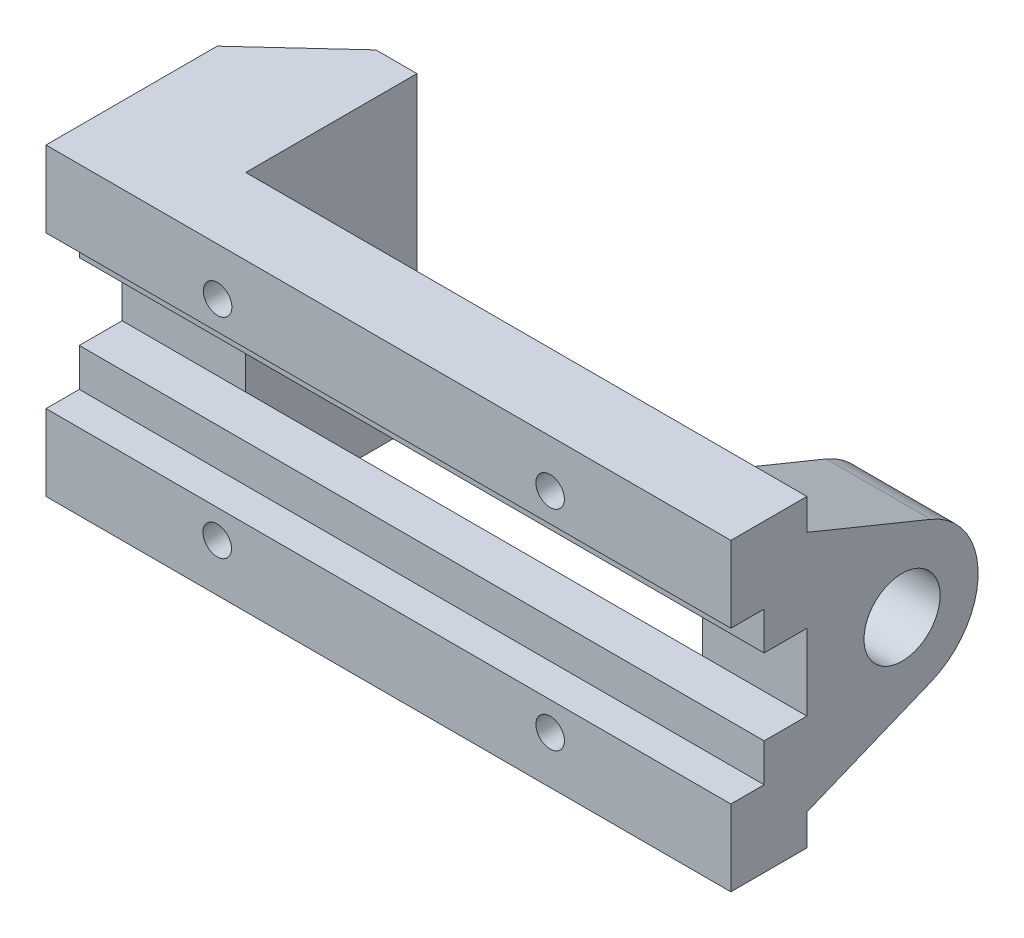
ISO-10303-21;
HEADER;
FILE_DESCRIPTION(('STEP AP214'),'2;1');
FILE_NAME('part.step','',(''),(''),'','','');
FILE_SCHEMA(('AUTOMOTIVE_DESIGN { 1 0 10303 214 1 1 1 1 }'));
ENDSEC;
DATA;
#1=APPLICATION_CONTEXT('core data for automotive mechanical design processes');
#2=APPLICATION_PROTOCOL_DEFINITION('international standard','automotive_design',2000,#1);
#3=PRODUCT_CONTEXT('',#1,'mechanical');
#4=PRODUCT('Part','Part','',(#3));
#5=PRODUCT_RELATED_PRODUCT_CATEGORY('part','',(#4));
#6=PRODUCT_DEFINITION_FORMATION('','',#4);
#7=PRODUCT_DEFINITION_CONTEXT('part definition',#1,'design');
#8=PRODUCT_DEFINITION('design','',#6,#7);
#9=PRODUCT_DEFINITION_SHAPE('','',#8);
#10=(LENGTH_UNIT() NAMED_UNIT(*) SI_UNIT(.MILLI.,.METRE.));
#11=(NAMED_UNIT(*) PLANE_ANGLE_UNIT() SI_UNIT($,.RADIAN.));
#12=(NAMED_UNIT(*) SI_UNIT($,.STERADIAN.) SOLID_ANGLE_UNIT());
#13=UNCERTAINTY_MEASURE_WITH_UNIT(LENGTH_MEASURE(1.E-05),#10,'distance_accuracy_value','');
#14=(GEOMETRIC_REPRESENTATION_CONTEXT(3) GLOBAL_UNCERTAINTY_ASSIGNED_CONTEXT((#13)) GLOBAL_UNIT_ASSIGNED_CONTEXT((#10,
#11,#12)) REPRESENTATION_CONTEXT('',''));
#15=CARTESIAN_POINT('',(0.,0.,0.));
#16=DIRECTION('',(0.,0.,1.));
#17=DIRECTION('',(1.,0.,0.));
#18=AXIS2_PLACEMENT_3D('',#15,#16,#17);
#19=CARTESIAN_POINT('',(26.,64.,0.));
#20=DIRECTION('',(0.,0.,1.));
#21=DIRECTION('',(1.,0.,0.));
#22=AXIS2_PLACEMENT_3D('',#19,#20,#21);
#23=PLANE('',#22);
#24=DIRECTION('',(1.,0.,0.));
#25=VECTOR('',#24,1.);
#26=CARTESIAN_POINT('',(0.,40.,0.));
#27=LINE('',#26,#25);
#28=CARTESIAN_POINT('',(26.,40.,0.));
#29=VERTEX_POINT('',#28);
#30=CARTESIAN_POINT('',(122.,40.,0.));
#31=VERTEX_POINT('',#30);
#32=EDGE_CURVE('E56',#29,#31,#27,.T.);
#33=ORIENTED_EDGE('',*,*,#32,.F.);
#34=DIRECTION('',(0.,-1.,0.));
#35=VECTOR('',#34,1.);
#36=CARTESIAN_POINT('',(26.,64.,0.));
#37=LINE('',#36,#35);
#38=CARTESIAN_POINT('',(26.,64.,0.));
#39=VERTEX_POINT('',#38);
#40=EDGE_CURVE('E212',#39,#29,#37,.T.);
#41=ORIENTED_EDGE('',*,*,#40,.F.);
#42=DIRECTION('',(-1.,0.,0.));
#43=VECTOR('',#42,1.);
#44=CARTESIAN_POINT('',(26.,64.,0.));
#45=LINE('',#44,#43);
#46=CARTESIAN_POINT('',(144.,64.,0.));
#47=VERTEX_POINT('',#46);
#48=EDGE_CURVE('E248',#47,#39,#45,.T.);
#49=ORIENTED_EDGE('',*,*,#48,.F.);
#50=DIRECTION('',(0.,-1.,0.));
#51=VECTOR('',#50,1.);
#52=CARTESIAN_POINT('',(144.,64.,0.));
#53=LINE('',#52,#51);
#54=CARTESIAN_POINT('',(144.,57.4600041271144,0.));
#55=VERTEX_POINT('',#54);
#56=EDGE_CURVE('E208',#47,#55,#53,.T.);
#57=ORIENTED_EDGE('',*,*,#56,.T.);
#58=DIRECTION('',(1.,0.,0.));
#59=VECTOR('',#58,1.);
#60=CARTESIAN_POINT('',(26.,57.4600041271144,0.));
#61=LINE('',#60,#59);
#62=CARTESIAN_POINT('',(122.,57.4600041271144,0.));
#63=VERTEX_POINT('',#62);
#64=EDGE_CURVE('E241',#63,#55,#61,.T.);
#65=ORIENTED_EDGE('',*,*,#64,.F.);
#66=DIRECTION('',(0.,1.,0.));
#67=VECTOR('',#66,1.);
#68=CARTESIAN_POINT('',(122.,64.,0.));
#69=LINE('',#68,#67);
#70=EDGE_CURVE('E264',#31,#63,#69,.T.);
#71=ORIENTED_EDGE('',*,*,#70,.F.);
#72=EDGE_LOOP('',(#33,#41,#49,#57,#65,#71));
#73=FACE_BOUND('',#72,.T.);
#74=ADVANCED_FACE('F33',(#73),#23,.F.);
#75=DIRECTION('',(1.,0.,0.));
#76=VECTOR('',#75,1.);
#77=CARTESIAN_POINT('',(0.,24.,0.));
#78=LINE('',#77,#76);
#79=CARTESIAN_POINT('',(26.,24.,0.));
#80=VERTEX_POINT('',#79);
#81=CARTESIAN_POINT('',(122.,24.,0.));
#82=VERTEX_POINT('',#81);
#83=EDGE_CURVE('E320',#80,#82,#78,.T.);
#84=ORIENTED_EDGE('',*,*,#83,.T.);
#85=CARTESIAN_POINT('',(122.,6.53999587288562,0.));
#86=VERTEX_POINT('',#85);
#87=EDGE_CURVE('E260',#86,#82,#69,.T.);
#88=ORIENTED_EDGE('',*,*,#87,.F.);
#89=DIRECTION('',(1.,0.,0.));
#90=VECTOR('',#89,1.);
#91=CARTESIAN_POINT('',(26.,6.53999587288562,0.));
#92=LINE('',#91,#90);
#93=CARTESIAN_POINT('',(144.,6.53999587288562,0.));
#94=VERTEX_POINT('',#93);
#95=EDGE_CURVE('E258',#86,#94,#92,.T.);
#96=ORIENTED_EDGE('',*,*,#95,.T.);
#97=CARTESIAN_POINT('',(144.,0.,0.));
#98=VERTEX_POINT('',#97);
#99=EDGE_CURVE('E211',#94,#98,#53,.T.);
#100=ORIENTED_EDGE('',*,*,#99,.T.);
#101=DIRECTION('',(-1.,0.,0.));
#102=VECTOR('',#101,1.);
#103=CARTESIAN_POINT('',(26.,0.,0.));
#104=LINE('',#103,#102);
#105=CARTESIAN_POINT('',(26.,0.,0.));
#106=VERTEX_POINT('',#105);
#107=EDGE_CURVE('E233',#98,#106,#104,.T.);
#108=ORIENTED_EDGE('',*,*,#107,.T.);
#109=EDGE_CURVE('E215',#80,#106,#37,.T.);
#110=ORIENTED_EDGE('',*,*,#109,.F.);
#111=EDGE_LOOP('',(#84,#88,#96,#100,#108,#110));
#112=FACE_BOUND('',#111,.T.);
#113=ADVANCED_FACE('F384',(#112),#23,.F.);
#114=CARTESIAN_POINT('',(0.,64.,16.));
#115=DIRECTION('',(0.,0.,-1.));
#116=DIRECTION('',(-1.,0.,0.));
#117=AXIS2_PLACEMENT_3D('',#114,#115,#116);
#118=PLANE('',#117);
#119=CARTESIAN_POINT('',(36.0805511071979,54.,16.));
#120=DIRECTION('',(0.,0.,1.));
#121=DIRECTION('',(1.,0.,0.));
#122=AXIS2_PLACEMENT_3D('',#119,#120,#121);
#123=CIRCLE('',#122,3.);
#124=CARTESIAN_POINT('',(39.0805511071979,54.,16.));
#125=VERTEX_POINT('',#124);
#126=EDGE_CURVE('E351',#125,#125,#123,.T.);
#127=ORIENTED_EDGE('',*,*,#126,.F.);
#128=EDGE_LOOP('',(#127));
#129=FACE_BOUND('',#128,.T.);
#130=CARTESIAN_POINT('',(106.,54.,16.));
#131=DIRECTION('',(0.,0.,1.));
#132=DIRECTION('',(1.,0.,0.));
#133=AXIS2_PLACEMENT_3D('',#130,#131,#132);
#134=CIRCLE('',#133,2.99999999999999);
#135=CARTESIAN_POINT('',(109.,54.,16.));
#136=VERTEX_POINT('',#135);
#137=EDGE_CURVE('E342',#136,#136,#134,.T.);
#138=ORIENTED_EDGE('',*,*,#137,.F.);
#139=EDGE_LOOP('',(#138));
#140=FACE_BOUND('',#139,.T.);
#141=DIRECTION('',(1.,0.,0.));
#142=VECTOR('',#141,1.);
#143=CARTESIAN_POINT('',(0.,48.,16.));
#144=LINE('',#143,#142);
#145=CARTESIAN_POINT('',(0.,48.,16.));
#146=VERTEX_POINT('',#145);
#147=CARTESIAN_POINT('',(144.,48.,16.));
#148=VERTEX_POINT('',#147);
#149=EDGE_CURVE('E309',#146,#148,#144,.T.);
#150=ORIENTED_EDGE('',*,*,#149,.T.);
#151=DIRECTION('',(0.,-1.,0.));
#152=VECTOR('',#151,1.);
#153=CARTESIAN_POINT('',(144.,64.,16.));
#154=LINE('',#153,#152);
#155=CARTESIAN_POINT('',(144.,64.,16.));
#156=VERTEX_POINT('',#155);
#157=EDGE_CURVE('E202',#156,#148,#154,.T.);
#158=ORIENTED_EDGE('',*,*,#157,.F.);
#159=DIRECTION('',(1.,0.,0.));
#160=VECTOR('',#159,1.);
#161=CARTESIAN_POINT('',(0.,64.,16.));
#162=LINE('',#161,#160);
#163=CARTESIAN_POINT('',(0.,64.,16.));
#164=VERTEX_POINT('',#163);
#165=EDGE_CURVE('E252',#164,#156,#162,.T.);
#166=ORIENTED_EDGE('',*,*,#165,.F.);
#167=DIRECTION('',(0.,-1.,0.));
#168=VECTOR('',#167,1.);
#169=CARTESIAN_POINT('',(0.,64.,16.));
#170=LINE('',#169,#168);
#171=EDGE_CURVE('E11',#164,#146,#170,.T.);
#172=ORIENTED_EDGE('',*,*,#171,.T.);
#173=EDGE_LOOP('',(#150,#158,#166,#172));
#174=FACE_BOUND('',#173,.T.);
#175=ADVANCED_FACE('F371',(#129,#140,#174),#118,.F.);
#176=CARTESIAN_POINT('',(144.,64.,0.));
#177=DIRECTION('',(-1.,0.,0.));
#178=DIRECTION('',(0.,0.,1.));
#179=AXIS2_PLACEMENT_3D('',#176,#177,#178);
#180=PLANE('',#179);
#181=CARTESIAN_POINT('',(144.,32.,-20.));
#182=DIRECTION('',(1.,0.,0.));
#183=DIRECTION('',(0.,0.,-1.));
#184=AXIS2_PLACEMENT_3D('',#181,#182,#183);
#185=CIRCLE('',#184,8.);
#186=CARTESIAN_POINT('',(144.,32.,-28.));
#187=VERTEX_POINT('',#186);
#188=EDGE_CURVE('E280',#187,#187,#185,.T.);
#189=ORIENTED_EDGE('',*,*,#188,.F.);
#190=EDGE_LOOP('',(#189));
#191=FACE_BOUND('',#190,.T.);
#192=DIRECTION('',(0.,0.,1.));
#193=VECTOR('',#192,1.);
#194=CARTESIAN_POINT('',(144.,48.,0.));
#195=LINE('',#194,#193);
#196=CARTESIAN_POINT('',(144.,48.,9.));
#197=VERTEX_POINT('',#196);
#198=EDGE_CURVE('E283',#197,#148,#195,.T.);
#199=ORIENTED_EDGE('',*,*,#198,.F.);
#200=DIRECTION('',(0.,1.,0.));
#201=VECTOR('',#200,1.);
#202=CARTESIAN_POINT('',(144.,64.,9.));
#203=LINE('',#202,#201);
#204=CARTESIAN_POINT('',(144.,40.,9.));
#205=VERTEX_POINT('',#204);
#206=EDGE_CURVE('E293',#205,#197,#203,.T.);
#207=ORIENTED_EDGE('',*,*,#206,.F.);
#208=DIRECTION('',(0.,0.,1.));
#209=VECTOR('',#208,1.);
#210=CARTESIAN_POINT('',(144.,40.,0.));
#211=LINE('',#210,#209);
#212=CARTESIAN_POINT('',(144.,40.,0.));
#213=VERTEX_POINT('',#212);
#214=EDGE_CURVE('E295',#213,#205,#211,.T.);
#215=ORIENTED_EDGE('',*,*,#214,.F.);
#216=DIRECTION('',(0.,-1.,0.));
#217=VECTOR('',#216,1.);
#218=CARTESIAN_POINT('',(144.,64.,0.));
#219=LINE('',#218,#217);
#220=CARTESIAN_POINT('',(144.,24.,0.));
#221=VERTEX_POINT('',#220);
#222=EDGE_CURVE('E304',#213,#221,#219,.T.);
#223=ORIENTED_EDGE('',*,*,#222,.T.);
#224=DIRECTION('',(0.,0.,-1.));
#225=VECTOR('',#224,1.);
#226=CARTESIAN_POINT('',(144.,24.,0.));
#227=LINE('',#226,#225);
#228=CARTESIAN_POINT('',(144.,24.,9.));
#229=VERTEX_POINT('',#228);
#230=EDGE_CURVE('E297',#229,#221,#227,.T.);
#231=ORIENTED_EDGE('',*,*,#230,.F.);
#232=DIRECTION('',(0.,-1.,0.));
#233=VECTOR('',#232,1.);
#234=CARTESIAN_POINT('',(144.,64.,9.));
#235=LINE('',#234,#233);
#236=CARTESIAN_POINT('',(144.,16.,9.));
#237=VERTEX_POINT('',#236);
#238=EDGE_CURVE('E299',#229,#237,#235,.T.);
#239=ORIENTED_EDGE('',*,*,#238,.T.);
#240=DIRECTION('',(0.,0.,1.));
#241=VECTOR('',#240,1.);
#242=CARTESIAN_POINT('',(144.,16.,0.));
#243=LINE('',#242,#241);
#244=CARTESIAN_POINT('',(144.,16.,16.));
#245=VERTEX_POINT('',#244);
#246=EDGE_CURVE('E302',#237,#245,#243,.T.);
#247=ORIENTED_EDGE('',*,*,#246,.T.);
#248=CARTESIAN_POINT('',(144.,0.,16.));
#249=VERTEX_POINT('',#248);
#250=EDGE_CURVE('E193',#245,#249,#154,.T.);
#251=ORIENTED_EDGE('',*,*,#250,.T.);
#252=DIRECTION('',(0.,0.,-1.));
#253=VECTOR('',#252,1.);
#254=CARTESIAN_POINT('',(144.,0.,0.));
#255=LINE('',#254,#253);
#256=EDGE_CURVE('E236',#249,#98,#255,.T.);
#257=ORIENTED_EDGE('',*,*,#256,.T.);
#258=ORIENTED_EDGE('',*,*,#99,.F.);
#259=DIRECTION('',(0.,0.378362300226237,-0.925657587754517));
#260=VECTOR('',#259,1.);
#261=CARTESIAN_POINT('',(144.,5.6037429459947,2.29052848371983));
#262=LINE('',#261,#260);
#263=CARTESIAN_POINT('',(144.,17.1894785959277,-26.0537968036198));
#264=VERTEX_POINT('',#263);
#265=EDGE_CURVE('E278',#94,#264,#262,.T.);
#266=ORIENTED_EDGE('',*,*,#265,.T.);
#267=CARTESIAN_POINT('',(144.,32.,-20.));
#268=DIRECTION('',(1.,0.,0.));
#269=DIRECTION('',(0.,0.,-1.));
#270=AXIS2_PLACEMENT_3D('',#267,#268,#269);
#271=CIRCLE('',#270,16.);
#272=CARTESIAN_POINT('',(144.,46.8105214040723,-26.0537968036198));
#273=VERTEX_POINT('',#272);
#274=EDGE_CURVE('E275',#264,#273,#271,.T.);
#275=ORIENTED_EDGE('',*,*,#274,.T.);
#276=DIRECTION('',(0.,-0.378362300226237,-0.925657587754517));
#277=VECTOR('',#276,1.);
#278=CARTESIAN_POINT('',(144.,49.234143119126,-20.124443300259));
#279=LINE('',#278,#277);
#280=EDGE_CURVE('E272',#55,#273,#279,.T.);
#281=ORIENTED_EDGE('',*,*,#280,.F.);
#282=ORIENTED_EDGE('',*,*,#56,.F.);
#283=DIRECTION('',(0.,0.,-1.));
#284=VECTOR('',#283,1.);
#285=CARTESIAN_POINT('',(144.,64.,0.));
#286=LINE('',#285,#284);
#287=EDGE_CURVE('E250',#156,#47,#286,.T.);
#288=ORIENTED_EDGE('',*,*,#287,.F.);
#289=ORIENTED_EDGE('',*,*,#157,.T.);
#290=EDGE_LOOP('',(#199,#207,#215,#223,#231,#239,#247,#251,#257,#258,#266,#275,#281,#282,#288,#289));
#291=FACE_BOUND('',#290,.T.);
#292=ADVANCED_FACE('F381',(#191,#291),#180,.F.);
#293=CARTESIAN_POINT('',(0.,64.,0.));
#294=DIRECTION('',(1.,0.,0.));
#295=DIRECTION('',(0.,0.,-1.));
#296=AXIS2_PLACEMENT_3D('',#293,#294,#295);
#297=PLANE('',#296);
#298=DIRECTION('',(0.,0.,-1.));
#299=VECTOR('',#298,1.);
#300=CARTESIAN_POINT('',(0.,48.,0.));
#301=LINE('',#300,#299);
#302=CARTESIAN_POINT('',(0.,48.,9.));
#303=VERTEX_POINT('',#302);
#304=EDGE_CURVE('E194',#146,#303,#301,.T.);
#305=ORIENTED_EDGE('',*,*,#304,.F.);
#306=ORIENTED_EDGE('',*,*,#171,.F.);
#307=DIRECTION('',(0.,0.,1.));
#308=VECTOR('',#307,1.);
#309=CARTESIAN_POINT('',(0.,64.,0.));
#310=LINE('',#309,#308);
#311=CARTESIAN_POINT('',(0.,64.,-20.));
#312=VERTEX_POINT('',#311);
#313=EDGE_CURVE('E226',#312,#164,#310,.T.);
#314=ORIENTED_EDGE('',*,*,#313,.F.);
#315=DIRECTION('',(0.,-1.,0.));
#316=VECTOR('',#315,1.);
#317=CARTESIAN_POINT('',(0.,64.,-20.));
#318=LINE('',#317,#316);
#319=CARTESIAN_POINT('',(0.,0.,-20.));
#320=VERTEX_POINT('',#319);
#321=EDGE_CURVE('E222',#312,#320,#318,.T.);
#322=ORIENTED_EDGE('',*,*,#321,.T.);
#323=DIRECTION('',(0.,0.,1.));
#324=VECTOR('',#323,1.);
#325=CARTESIAN_POINT('',(0.,0.,0.));
#326=LINE('',#325,#324);
#327=CARTESIAN_POINT('',(0.,0.,16.));
#328=VERTEX_POINT('',#327);
#329=EDGE_CURVE('E200',#320,#328,#326,.T.);
#330=ORIENTED_EDGE('',*,*,#329,.T.);
#331=CARTESIAN_POINT('',(0.,16.,16.));
#332=VERTEX_POINT('',#331);
#333=EDGE_CURVE('E41',#332,#328,#170,.T.);
#334=ORIENTED_EDGE('',*,*,#333,.F.);
#335=DIRECTION('',(0.,0.,-1.));
#336=VECTOR('',#335,1.);
#337=CARTESIAN_POINT('',(0.,16.,0.));
#338=LINE('',#337,#336);
#339=CARTESIAN_POINT('',(0.,16.,9.));
#340=VERTEX_POINT('',#339);
#341=EDGE_CURVE('E179',#332,#340,#338,.T.);
#342=ORIENTED_EDGE('',*,*,#341,.T.);
#343=DIRECTION('',(0.,1.,0.));
#344=VECTOR('',#343,1.);
#345=CARTESIAN_POINT('',(0.,0.,9.));
#346=LINE('',#345,#344);
#347=CARTESIAN_POINT('',(0.,24.,9.));
#348=VERTEX_POINT('',#347);
#349=EDGE_CURVE('E48',#340,#348,#346,.T.);
#350=ORIENTED_EDGE('',*,*,#349,.T.);
#351=DIRECTION('',(0.,0.,1.));
#352=VECTOR('',#351,1.);
#353=CARTESIAN_POINT('',(0.,24.,0.));
#354=LINE('',#353,#352);
#355=CARTESIAN_POINT('',(0.,24.,0.));
#356=VERTEX_POINT('',#355);
#357=EDGE_CURVE('E339',#356,#348,#354,.T.);
#358=ORIENTED_EDGE('',*,*,#357,.F.);
#359=DIRECTION('',(0.,1.,0.));
#360=VECTOR('',#359,1.);
#361=CARTESIAN_POINT('',(0.,0.,0.));
#362=LINE('',#361,#360);
#363=CARTESIAN_POINT('',(0.,40.,0.));
#364=VERTEX_POINT('',#363);
#365=EDGE_CURVE('E336',#356,#364,#362,.T.);
#366=ORIENTED_EDGE('',*,*,#365,.T.);
#367=DIRECTION('',(0.,0.,-1.));
#368=VECTOR('',#367,1.);
#369=CARTESIAN_POINT('',(0.,40.,0.));
#370=LINE('',#369,#368);
#371=CARTESIAN_POINT('',(0.,40.,9.));
#372=VERTEX_POINT('',#371);
#373=EDGE_CURVE('E334',#372,#364,#370,.T.);
#374=ORIENTED_EDGE('',*,*,#373,.F.);
#375=DIRECTION('',(0.,-1.,0.));
#376=VECTOR('',#375,1.);
#377=CARTESIAN_POINT('',(0.,0.,9.));
#378=LINE('',#377,#376);
#379=EDGE_CURVE('E332',#303,#372,#378,.T.);
#380=ORIENTED_EDGE('',*,*,#379,.F.);
#381=EDGE_LOOP('',(#305,#306,#314,#322,#330,#334,#342,#350,#358,#366,#374,#380));
#382=FACE_BOUND('',#381,.T.);
#383=ADVANCED_FACE('F197',(#382),#297,.F.);
#384=CARTESIAN_POINT('',(106.,10.,16.));
#385=DIRECTION('',(0.,0.,1.));
#386=DIRECTION('',(1.,0.,0.));
#387=AXIS2_PLACEMENT_3D('',#384,#385,#386);
#388=CIRCLE('',#387,3.00000000000001);
#389=CARTESIAN_POINT('',(109.,10.,16.));
#390=VERTEX_POINT('',#389);
#391=EDGE_CURVE('E357',#390,#390,#388,.T.);
#392=ORIENTED_EDGE('',*,*,#391,.F.);
#393=EDGE_LOOP('',(#392));
#394=FACE_BOUND('',#393,.T.);
#395=CARTESIAN_POINT('',(36.,10.,16.));
#396=DIRECTION('',(0.,0.,1.));
#397=DIRECTION('',(1.,0.,0.));
#398=AXIS2_PLACEMENT_3D('',#395,#396,#397);
#399=CIRCLE('',#398,3.);
#400=CARTESIAN_POINT('',(39.,10.,16.));
#401=VERTEX_POINT('',#400);
#402=EDGE_CURVE('E345',#401,#401,#399,.T.);
#403=ORIENTED_EDGE('',*,*,#402,.F.);
#404=EDGE_LOOP('',(#403));
#405=FACE_BOUND('',#404,.T.);
#406=ORIENTED_EDGE('',*,*,#250,.F.);
#407=DIRECTION('',(1.,0.,0.));
#408=VECTOR('',#407,1.);
#409=CARTESIAN_POINT('',(0.,16.,16.));
#410=LINE('',#409,#408);
#411=EDGE_CURVE('E182',#332,#245,#410,.T.);
#412=ORIENTED_EDGE('',*,*,#411,.F.);
#413=ORIENTED_EDGE('',*,*,#333,.T.);
#414=DIRECTION('',(1.,0.,0.));
#415=VECTOR('',#414,1.);
#416=CARTESIAN_POINT('',(0.,0.,16.));
#417=LINE('',#416,#415);
#418=EDGE_CURVE('E239',#328,#249,#417,.T.);
#419=ORIENTED_EDGE('',*,*,#418,.T.);
#420=EDGE_LOOP('',(#406,#412,#413,#419));
#421=FACE_BOUND('',#420,.T.);
#422=ADVANCED_FACE('F35',(#394,#405,#421),#118,.F.);
#423=CARTESIAN_POINT('',(26.,64.,-36.));
#424=DIRECTION('',(-1.,0.,0.));
#425=DIRECTION('',(0.,0.,1.));
#426=AXIS2_PLACEMENT_3D('',#423,#424,#425);
#427=PLANE('',#426);
#428=DIRECTION('',(0.,0.,-1.));
#429=VECTOR('',#428,1.);
#430=CARTESIAN_POINT('',(26.,0.,-36.));
#431=LINE('',#430,#429);
#432=CARTESIAN_POINT('',(26.,0.,-36.));
#433=VERTEX_POINT('',#432);
#434=EDGE_CURVE('E231',#106,#433,#431,.T.);
#435=ORIENTED_EDGE('',*,*,#434,.T.);
#436=DIRECTION('',(0.,-1.,0.));
#437=VECTOR('',#436,1.);
#438=CARTESIAN_POINT('',(26.,64.,-36.));
#439=LINE('',#438,#437);
#440=CARTESIAN_POINT('',(26.,64.,-36.));
#441=VERTEX_POINT('',#440);
#442=EDGE_CURVE('E216',#441,#433,#439,.T.);
#443=ORIENTED_EDGE('',*,*,#442,.F.);
#444=DIRECTION('',(0.,0.,-1.));
#445=VECTOR('',#444,1.);
#446=CARTESIAN_POINT('',(26.,64.,-36.));
#447=LINE('',#446,#445);
#448=EDGE_CURVE('E246',#39,#441,#447,.T.);
#449=ORIENTED_EDGE('',*,*,#448,.F.);
#450=ORIENTED_EDGE('',*,*,#40,.T.);
#451=DIRECTION('',(0.,-1.,0.));
#452=VECTOR('',#451,1.);
#453=CARTESIAN_POINT('',(26.,64.,0.));
#454=LINE('',#453,#452);
#455=EDGE_CURVE('E307',#29,#80,#454,.T.);
#456=ORIENTED_EDGE('',*,*,#455,.T.);
#457=ORIENTED_EDGE('',*,*,#109,.T.);
#458=EDGE_LOOP('',(#435,#443,#449,#450,#456,#457));
#459=FACE_BOUND('',#458,.T.);
#460=ADVANCED_FACE('F369',(#459),#427,.F.);
#461=CARTESIAN_POINT('',(17.3622207163848,64.,-36.));
#462=DIRECTION('',(0.,0.,1.));
#463=DIRECTION('',(1.,0.,0.));
#464=AXIS2_PLACEMENT_3D('',#461,#462,#463);
#465=PLANE('',#464);
#466=DIRECTION('',(-1.,0.,0.));
#467=VECTOR('',#466,1.);
#468=CARTESIAN_POINT('',(17.3622207163848,0.,-36.));
#469=LINE('',#468,#467);
#470=CARTESIAN_POINT('',(17.3622207163848,0.,-36.));
#471=VERTEX_POINT('',#470);
#472=EDGE_CURVE('E229',#433,#471,#469,.T.);
#473=ORIENTED_EDGE('',*,*,#472,.T.);
#474=DIRECTION('',(0.,-1.,0.));
#475=VECTOR('',#474,1.);
#476=CARTESIAN_POINT('',(17.3622207163848,64.,-36.));
#477=LINE('',#476,#475);
#478=CARTESIAN_POINT('',(17.3622207163848,64.,-36.));
#479=VERTEX_POINT('',#478);
#480=EDGE_CURVE('E219',#479,#471,#477,.T.);
#481=ORIENTED_EDGE('',*,*,#480,.F.);
#482=DIRECTION('',(-1.,0.,0.));
#483=VECTOR('',#482,1.);
#484=CARTESIAN_POINT('',(17.3622207163848,64.,-36.));
#485=LINE('',#484,#483);
#486=EDGE_CURVE('E244',#441,#479,#485,.T.);
#487=ORIENTED_EDGE('',*,*,#486,.F.);
#488=ORIENTED_EDGE('',*,*,#442,.T.);
#489=EDGE_LOOP('',(#473,#481,#487,#488));
#490=FACE_BOUND('',#489,.T.);
#491=ADVANCED_FACE('F377',(#490),#465,.F.);
#492=CARTESIAN_POINT('',(17.3622207163848,64.,-36.));
#493=DIRECTION('',(0.677670070060475,0.,0.735366083079871));
#494=DIRECTION('',(0.735366083079871,0.,-0.677670070060475));
#495=AXIS2_PLACEMENT_3D('',#492,#493,#494);
#496=PLANE('',#495);
#497=DIRECTION('',(-0.735366083079871,0.,0.677670070060475));
#498=VECTOR('',#497,1.);
#499=CARTESIAN_POINT('',(17.3622207163848,0.,-36.));
#500=LINE('',#499,#498);
#501=EDGE_CURVE('E227',#471,#320,#500,.T.);
#502=ORIENTED_EDGE('',*,*,#501,.T.);
#503=ORIENTED_EDGE('',*,*,#321,.F.);
#504=DIRECTION('',(-0.735366083079871,0.,0.677670070060475));
#505=VECTOR('',#504,1.);
#506=CARTESIAN_POINT('',(17.3622207163848,64.,-36.));
#507=LINE('',#506,#505);
#508=EDGE_CURVE('E224',#479,#312,#507,.T.);
#509=ORIENTED_EDGE('',*,*,#508,.F.);
#510=ORIENTED_EDGE('',*,*,#480,.T.);
#511=EDGE_LOOP('',(#502,#503,#509,#510));
#512=FACE_BOUND('',#511,.T.);
#513=ADVANCED_FACE('F464',(#512),#496,.F.);
#514=CARTESIAN_POINT('',(0.,64.,0.));
#515=DIRECTION('',(0.,1.,0.));
#516=DIRECTION('',(0.,0.,1.));
#517=AXIS2_PLACEMENT_3D('',#514,#515,#516);
#518=PLANE('',#517);
#519=ORIENTED_EDGE('',*,*,#313,.T.);
#520=ORIENTED_EDGE('',*,*,#165,.T.);
#521=ORIENTED_EDGE('',*,*,#287,.T.);
#522=ORIENTED_EDGE('',*,*,#48,.T.);
#523=ORIENTED_EDGE('',*,*,#448,.T.);
#524=ORIENTED_EDGE('',*,*,#486,.T.);
#525=ORIENTED_EDGE('',*,*,#508,.T.);
#526=EDGE_LOOP('',(#519,#520,#521,#522,#523,#524,#525));
#527=FACE_BOUND('',#526,.T.);
#528=ADVANCED_FACE('F428',(#527),#518,.T.);
#529=CARTESIAN_POINT('',(0.,0.,0.));
#530=DIRECTION('',(0.,1.,0.));
#531=DIRECTION('',(0.,0.,1.));
#532=AXIS2_PLACEMENT_3D('',#529,#530,#531);
#533=PLANE('',#532);
#534=ORIENTED_EDGE('',*,*,#418,.F.);
#535=ORIENTED_EDGE('',*,*,#329,.F.);
#536=ORIENTED_EDGE('',*,*,#501,.F.);
#537=ORIENTED_EDGE('',*,*,#472,.F.);
#538=ORIENTED_EDGE('',*,*,#434,.F.);
#539=ORIENTED_EDGE('',*,*,#107,.F.);
#540=ORIENTED_EDGE('',*,*,#256,.F.);
#541=EDGE_LOOP('',(#534,#535,#536,#537,#538,#539,#540));
#542=FACE_BOUND('',#541,.T.);
#543=ADVANCED_FACE('F461',(#542),#533,.F.);
#544=CARTESIAN_POINT('',(122.,49.234143119126,-20.124443300259));
#545=DIRECTION('',(0.,-0.925657587754517,0.378362300226237));
#546=DIRECTION('',(0.,-0.378362300226237,-0.925657587754517));
#547=AXIS2_PLACEMENT_3D('',#544,#545,#546);
#548=PLANE('',#547);
#549=DIRECTION('',(0.,-0.378362300226237,-0.925657587754517));
#550=VECTOR('',#549,1.);
#551=CARTESIAN_POINT('',(122.,49.234143119126,-20.124443300259));
#552=LINE('',#551,#550);
#553=CARTESIAN_POINT('',(122.,46.8105214040723,-26.0537968036198));
#554=VERTEX_POINT('',#553);
#555=EDGE_CURVE('E269',#63,#554,#552,.T.);
#556=ORIENTED_EDGE('',*,*,#555,.F.);
#557=ORIENTED_EDGE('',*,*,#64,.T.);
#558=ORIENTED_EDGE('',*,*,#280,.T.);
#559=DIRECTION('',(1.,0.,0.));
#560=VECTOR('',#559,1.);
#561=CARTESIAN_POINT('',(122.,46.8105214040723,-26.0537968036198));
#562=LINE('',#561,#560);
#563=EDGE_CURVE('E268',#554,#273,#562,.T.);
#564=ORIENTED_EDGE('',*,*,#563,.F.);
#565=EDGE_LOOP('',(#556,#557,#558,#564));
#566=FACE_BOUND('',#565,.T.);
#567=ADVANCED_FACE('F434',(#566),#548,.F.);
#568=CARTESIAN_POINT('',(122.,5.6037429459947,2.29052848371983));
#569=DIRECTION('',(0.,-0.925657587754517,-0.378362300226237));
#570=DIRECTION('',(0.,0.378362300226237,-0.925657587754517));
#571=AXIS2_PLACEMENT_3D('',#568,#569,#570);
#572=PLANE('',#571);
#573=ORIENTED_EDGE('',*,*,#95,.F.);
#574=DIRECTION('',(0.,0.378362300226237,-0.925657587754517));
#575=VECTOR('',#574,1.);
#576=CARTESIAN_POINT('',(122.,5.6037429459947,2.29052848371983));
#577=LINE('',#576,#575);
#578=CARTESIAN_POINT('',(122.,17.1894785959277,-26.0537968036198));
#579=VERTEX_POINT('',#578);
#580=EDGE_CURVE('E288',#86,#579,#577,.T.);
#581=ORIENTED_EDGE('',*,*,#580,.T.);
#582=DIRECTION('',(1.,0.,0.));
#583=VECTOR('',#582,1.);
#584=CARTESIAN_POINT('',(122.,17.1894785959277,-26.0537968036198));
#585=LINE('',#584,#583);
#586=EDGE_CURVE('E265',#579,#264,#585,.T.);
#587=ORIENTED_EDGE('',*,*,#586,.T.);
#588=ORIENTED_EDGE('',*,*,#265,.F.);
#589=EDGE_LOOP('',(#573,#581,#587,#588));
#590=FACE_BOUND('',#589,.T.);
#591=ADVANCED_FACE('F480',(#590),#572,.T.);
#592=CARTESIAN_POINT('',(122.,0.,0.));
#593=DIRECTION('',(1.,0.,0.));
#594=DIRECTION('',(0.,0.,-1.));
#595=AXIS2_PLACEMENT_3D('',#592,#593,#594);
#596=PLANE('',#595);
#597=CARTESIAN_POINT('',(122.,32.,-20.));
#598=DIRECTION('',(1.,0.,0.));
#599=DIRECTION('',(0.,0.,-1.));
#600=AXIS2_PLACEMENT_3D('',#597,#598,#599);
#601=CIRCLE('',#600,8.);
#602=CARTESIAN_POINT('',(122.,32.,-28.));
#603=VERTEX_POINT('',#602);
#604=EDGE_CURVE('E274',#603,#603,#601,.T.);
#605=ORIENTED_EDGE('',*,*,#604,.T.);
#606=EDGE_LOOP('',(#605));
#607=FACE_BOUND('',#606,.T.);
#608=ORIENTED_EDGE('',*,*,#580,.F.);
#609=ORIENTED_EDGE('',*,*,#87,.T.);
#610=EDGE_CURVE('E263',#82,#31,#69,.T.);
#611=ORIENTED_EDGE('',*,*,#610,.T.);
#612=ORIENTED_EDGE('',*,*,#70,.T.);
#613=ORIENTED_EDGE('',*,*,#555,.T.);
#614=CARTESIAN_POINT('',(122.,32.,-20.));
#615=DIRECTION('',(1.,0.,0.));
#616=DIRECTION('',(0.,0.,-1.));
#617=AXIS2_PLACEMENT_3D('',#614,#615,#616);
#618=CIRCLE('',#617,16.);
#619=EDGE_CURVE('E285',#579,#554,#618,.T.);
#620=ORIENTED_EDGE('',*,*,#619,.F.);
#621=EDGE_LOOP('',(#608,#609,#611,#612,#613,#620));
#622=FACE_BOUND('',#621,.T.);
#623=ADVANCED_FACE('F445',(#607,#622),#596,.F.);
#624=CARTESIAN_POINT('',(122.,32.,-20.));
#625=DIRECTION('',(1.,0.,0.));
#626=DIRECTION('',(0.,0.,-1.));
#627=AXIS2_PLACEMENT_3D('',#624,#625,#626);
#628=CYLINDRICAL_SURFACE('',#627,16.);
#629=ORIENTED_EDGE('',*,*,#274,.F.);
#630=ORIENTED_EDGE('',*,*,#586,.F.);
#631=ORIENTED_EDGE('',*,*,#619,.T.);
#632=ORIENTED_EDGE('',*,*,#563,.T.);
#633=EDGE_LOOP('',(#629,#630,#631,#632));
#634=FACE_BOUND('',#633,.T.);
#635=ADVANCED_FACE('F441',(#634),#628,.T.);
#636=CARTESIAN_POINT('',(122.,32.,-20.));
#637=DIRECTION('',(1.,0.,0.));
#638=DIRECTION('',(0.,0.,-1.));
#639=AXIS2_PLACEMENT_3D('',#636,#637,#638);
#640=CYLINDRICAL_SURFACE('',#639,8.);
#641=ORIENTED_EDGE('',*,*,#604,.F.);
#642=EDGE_LOOP('',(#641));
#643=FACE_BOUND('',#642,.T.);
#644=ORIENTED_EDGE('',*,*,#188,.T.);
#645=EDGE_LOOP('',(#644));
#646=FACE_BOUND('',#645,.T.);
#647=ADVANCED_FACE('F476',(#643,#646),#640,.F.);
#648=CARTESIAN_POINT('',(0.,48.,0.));
#649=DIRECTION('',(0.,-1.,0.));
#650=DIRECTION('',(0.,0.,-1.));
#651=AXIS2_PLACEMENT_3D('',#648,#649,#650);
#652=PLANE('',#651);
#653=ORIENTED_EDGE('',*,*,#198,.T.);
#654=ORIENTED_EDGE('',*,*,#149,.F.);
#655=ORIENTED_EDGE('',*,*,#304,.T.);
#656=DIRECTION('',(1.,0.,0.));
#657=VECTOR('',#656,1.);
#658=CARTESIAN_POINT('',(0.,48.,9.));
#659=LINE('',#658,#657);
#660=EDGE_CURVE('E326',#303,#197,#659,.T.);
#661=ORIENTED_EDGE('',*,*,#660,.T.);
#662=EDGE_LOOP('',(#653,#654,#655,#661));
#663=FACE_BOUND('',#662,.T.);
#664=ADVANCED_FACE('F403',(#663),#652,.T.);
#665=CARTESIAN_POINT('',(0.,0.,9.));
#666=DIRECTION('',(0.,0.,1.));
#667=DIRECTION('',(1.,0.,0.));
#668=AXIS2_PLACEMENT_3D('',#665,#666,#667);
#669=PLANE('',#668);
#670=ORIENTED_EDGE('',*,*,#206,.T.);
#671=ORIENTED_EDGE('',*,*,#660,.F.);
#672=ORIENTED_EDGE('',*,*,#379,.T.);
#673=DIRECTION('',(1.,0.,0.));
#674=VECTOR('',#673,1.);
#675=CARTESIAN_POINT('',(0.,40.,9.));
#676=LINE('',#675,#674);
#677=EDGE_CURVE('E323',#372,#205,#676,.T.);
#678=ORIENTED_EDGE('',*,*,#677,.T.);
#679=EDGE_LOOP('',(#670,#671,#672,#678));
#680=FACE_BOUND('',#679,.T.);
#681=ADVANCED_FACE('F410',(#680),#669,.T.);
#682=CARTESIAN_POINT('',(0.,40.,0.));
#683=DIRECTION('',(0.,-1.,0.));
#684=DIRECTION('',(0.,0.,-1.));
#685=AXIS2_PLACEMENT_3D('',#682,#683,#684);
#686=PLANE('',#685);
#687=ORIENTED_EDGE('',*,*,#214,.T.);
#688=ORIENTED_EDGE('',*,*,#677,.F.);
#689=ORIENTED_EDGE('',*,*,#373,.T.);
#690=EDGE_CURVE('E321',#364,#29,#27,.T.);
#691=ORIENTED_EDGE('',*,*,#690,.T.);
#692=ORIENTED_EDGE('',*,*,#32,.T.);
#693=EDGE_CURVE('E319',#31,#213,#27,.T.);
#694=ORIENTED_EDGE('',*,*,#693,.T.);
#695=EDGE_LOOP('',(#687,#688,#689,#691,#692,#694));
#696=FACE_BOUND('',#695,.T.);
#697=ADVANCED_FACE('F412',(#696),#686,.T.);
#698=CARTESIAN_POINT('',(0.,24.,0.));
#699=DIRECTION('',(0.,1.,0.));
#700=DIRECTION('',(0.,0.,1.));
#701=AXIS2_PLACEMENT_3D('',#698,#699,#700);
#702=PLANE('',#701);
#703=ORIENTED_EDGE('',*,*,#230,.T.);
#704=EDGE_CURVE('E315',#82,#221,#78,.T.);
#705=ORIENTED_EDGE('',*,*,#704,.F.);
#706=ORIENTED_EDGE('',*,*,#83,.F.);
#707=EDGE_CURVE('E316',#356,#80,#78,.T.);
#708=ORIENTED_EDGE('',*,*,#707,.F.);
#709=ORIENTED_EDGE('',*,*,#357,.T.);
#710=DIRECTION('',(1.,0.,0.));
#711=VECTOR('',#710,1.);
#712=CARTESIAN_POINT('',(0.,24.,9.));
#713=LINE('',#712,#711);
#714=EDGE_CURVE('E312',#348,#229,#713,.T.);
#715=ORIENTED_EDGE('',*,*,#714,.T.);
#716=EDGE_LOOP('',(#703,#705,#706,#708,#709,#715));
#717=FACE_BOUND('',#716,.T.);
#718=ADVANCED_FACE('F452',(#717),#702,.T.);
#719=CARTESIAN_POINT('',(0.,0.,9.));
#720=DIRECTION('',(0.,0.,-1.));
#721=DIRECTION('',(-1.,0.,0.));
#722=AXIS2_PLACEMENT_3D('',#719,#720,#721);
#723=PLANE('',#722);
#724=ORIENTED_EDGE('',*,*,#714,.F.);
#725=ORIENTED_EDGE('',*,*,#349,.F.);
#726=DIRECTION('',(1.,0.,0.));
#727=VECTOR('',#726,1.);
#728=CARTESIAN_POINT('',(0.,16.,9.));
#729=LINE('',#728,#727);
#730=EDGE_CURVE('E184',#340,#237,#729,.T.);
#731=ORIENTED_EDGE('',*,*,#730,.T.);
#732=ORIENTED_EDGE('',*,*,#238,.F.);
#733=EDGE_LOOP('',(#724,#725,#731,#732));
#734=FACE_BOUND('',#733,.T.);
#735=ADVANCED_FACE('F493',(#734),#723,.F.);
#736=CARTESIAN_POINT('',(0.,16.,0.));
#737=DIRECTION('',(0.,-1.,0.));
#738=DIRECTION('',(0.,0.,-1.));
#739=AXIS2_PLACEMENT_3D('',#736,#737,#738);
#740=PLANE('',#739);
#741=ORIENTED_EDGE('',*,*,#730,.F.);
#742=ORIENTED_EDGE('',*,*,#341,.F.);
#743=ORIENTED_EDGE('',*,*,#411,.T.);
#744=ORIENTED_EDGE('',*,*,#246,.F.);
#745=EDGE_LOOP('',(#741,#742,#743,#744));
#746=FACE_BOUND('',#745,.T.);
#747=ADVANCED_FACE('F181',(#746),#740,.F.);
#748=CARTESIAN_POINT('',(0.,0.,0.));
#749=DIRECTION('',(0.,0.,-1.));
#750=DIRECTION('',(-1.,0.,0.));
#751=AXIS2_PLACEMENT_3D('',#748,#749,#750);
#752=PLANE('',#751);
#753=ORIENTED_EDGE('',*,*,#693,.F.);
#754=ORIENTED_EDGE('',*,*,#610,.F.);
#755=ORIENTED_EDGE('',*,*,#704,.T.);
#756=ORIENTED_EDGE('',*,*,#222,.F.);
#757=EDGE_LOOP('',(#753,#754,#755,#756));
#758=FACE_BOUND('',#757,.T.);
#759=ADVANCED_FACE('F449',(#758),#752,.F.);
#760=ORIENTED_EDGE('',*,*,#690,.F.);
#761=ORIENTED_EDGE('',*,*,#365,.F.);
#762=ORIENTED_EDGE('',*,*,#707,.T.);
#763=ORIENTED_EDGE('',*,*,#455,.F.);
#764=EDGE_LOOP('',(#760,#761,#762,#763));
#765=FACE_BOUND('',#764,.T.);
#766=ADVANCED_FACE('F417',(#765),#752,.F.);
#767=CARTESIAN_POINT('',(36.,10.,5.));
#768=DIRECTION('',(0.,0.,1.));
#769=DIRECTION('',(1.,0.,0.));
#770=AXIS2_PLACEMENT_3D('',#767,#768,#769);
#771=CYLINDRICAL_SURFACE('',#770,3.);
#772=CARTESIAN_POINT('',(36.,10.,5.));
#773=DIRECTION('',(0.,0.,1.));
#774=DIRECTION('',(1.,0.,0.));
#775=AXIS2_PLACEMENT_3D('',#772,#773,#774);
#776=CIRCLE('',#775,3.);
#777=CARTESIAN_POINT('',(39.,10.,5.));
#778=VERTEX_POINT('',#777);
#779=EDGE_CURVE('E360',#778,#778,#776,.T.);
#780=ORIENTED_EDGE('',*,*,#779,.F.);
#781=EDGE_LOOP('',(#780));
#782=FACE_BOUND('',#781,.T.);
#783=ORIENTED_EDGE('',*,*,#402,.T.);
#784=EDGE_LOOP('',(#783));
#785=FACE_BOUND('',#784,.T.);
#786=ADVANCED_FACE('F366',(#782,#785),#771,.F.);
#787=CARTESIAN_POINT('',(0.,0.,5.));
#788=DIRECTION('',(0.,0.,1.));
#789=DIRECTION('',(1.,0.,0.));
#790=AXIS2_PLACEMENT_3D('',#787,#788,#789);
#791=PLANE('',#790);
#792=ORIENTED_EDGE('',*,*,#779,.T.);
#793=EDGE_LOOP('',(#792));
#794=FACE_BOUND('',#793,.T.);
#795=ADVANCED_FACE('F529',(#794),#791,.T.);
#796=CARTESIAN_POINT('',(106.,10.,5.));
#797=DIRECTION('',(0.,0.,1.));
#798=DIRECTION('',(1.,0.,0.));
#799=AXIS2_PLACEMENT_3D('',#796,#797,#798);
#800=CYLINDRICAL_SURFACE('',#799,3.00000000000001);
#801=CARTESIAN_POINT('',(106.,10.,5.));
#802=DIRECTION('',(0.,0.,1.));
#803=DIRECTION('',(1.,0.,0.));
#804=AXIS2_PLACEMENT_3D('',#801,#802,#803);
#805=CIRCLE('',#804,3.00000000000001);
#806=CARTESIAN_POINT('',(109.,10.,5.));
#807=VERTEX_POINT('',#806);
#808=EDGE_CURVE('E354',#807,#807,#805,.T.);
#809=ORIENTED_EDGE('',*,*,#808,.F.);
#810=EDGE_LOOP('',(#809));
#811=FACE_BOUND('',#810,.T.);
#812=ORIENTED_EDGE('',*,*,#391,.T.);
#813=EDGE_LOOP('',(#812));
#814=FACE_BOUND('',#813,.T.);
#815=ADVANCED_FACE('F525',(#811,#814),#800,.F.);
#816=CARTESIAN_POINT('',(0.,0.,5.));
#817=DIRECTION('',(0.,0.,1.));
#818=DIRECTION('',(1.,0.,0.));
#819=AXIS2_PLACEMENT_3D('',#816,#817,#818);
#820=PLANE('',#819);
#821=ORIENTED_EDGE('',*,*,#808,.T.);
#822=EDGE_LOOP('',(#821));
#823=FACE_BOUND('',#822,.T.);
#824=ADVANCED_FACE('F510',(#823),#820,.T.);
#825=CARTESIAN_POINT('',(106.,54.,5.));
#826=DIRECTION('',(0.,0.,1.));
#827=DIRECTION('',(1.,0.,0.));
#828=AXIS2_PLACEMENT_3D('',#825,#826,#827);
#829=CYLINDRICAL_SURFACE('',#828,2.99999999999999);
#830=CARTESIAN_POINT('',(106.,54.,5.));
#831=DIRECTION('',(0.,0.,1.));
#832=DIRECTION('',(1.,0.,0.));
#833=AXIS2_PLACEMENT_3D('',#830,#831,#832);
#834=CIRCLE('',#833,2.99999999999999);
#835=CARTESIAN_POINT('',(109.,54.,5.));
#836=VERTEX_POINT('',#835);
#837=EDGE_CURVE('E187',#836,#836,#834,.T.);
#838=ORIENTED_EDGE('',*,*,#837,.F.);
#839=EDGE_LOOP('',(#838));
#840=FACE_BOUND('',#839,.T.);
#841=ORIENTED_EDGE('',*,*,#137,.T.);
#842=EDGE_LOOP('',(#841));
#843=FACE_BOUND('',#842,.T.);
#844=ADVANCED_FACE('F506',(#840,#843),#829,.F.);
#845=CARTESIAN_POINT('',(0.,0.,5.));
#846=DIRECTION('',(0.,0.,1.));
#847=DIRECTION('',(1.,0.,0.));
#848=AXIS2_PLACEMENT_3D('',#845,#846,#847);
#849=PLANE('',#848);
#850=ORIENTED_EDGE('',*,*,#837,.T.);
#851=EDGE_LOOP('',(#850));
#852=FACE_BOUND('',#851,.T.);
#853=ADVANCED_FACE('F509',(#852),#849,.T.);
#854=CARTESIAN_POINT('',(36.0805511071979,54.,5.));
#855=DIRECTION('',(0.,0.,1.));
#856=DIRECTION('',(1.,0.,0.));
#857=AXIS2_PLACEMENT_3D('',#854,#855,#856);
#858=CYLINDRICAL_SURFACE('',#857,3.);
#859=CARTESIAN_POINT('',(36.0805511071979,54.,5.));
#860=DIRECTION('',(0.,0.,1.));
#861=DIRECTION('',(1.,0.,0.));
#862=AXIS2_PLACEMENT_3D('',#859,#860,#861);
#863=CIRCLE('',#862,3.);
#864=CARTESIAN_POINT('',(39.0805511071979,54.,5.));
#865=VERTEX_POINT('',#864);
#866=EDGE_CURVE('E348',#865,#865,#863,.T.);
#867=ORIENTED_EDGE('',*,*,#866,.F.);
#868=EDGE_LOOP('',(#867));
#869=FACE_BOUND('',#868,.T.);
#870=ORIENTED_EDGE('',*,*,#126,.T.);
#871=EDGE_LOOP('',(#870));
#872=FACE_BOUND('',#871,.T.);
#873=ADVANCED_FACE('F514',(#869,#872),#858,.F.);
#874=CARTESIAN_POINT('',(36.0805511071979,54.,5.));
#875=DIRECTION('',(0.,0.,1.));
#876=DIRECTION('',(1.,0.,0.));
#877=AXIS2_PLACEMENT_3D('',#874,#875,#876);
#878=PLANE('',#877);
#879=ORIENTED_EDGE('',*,*,#866,.T.);
#880=EDGE_LOOP('',(#879));
#881=FACE_BOUND('',#880,.T.);
#882=ADVANCED_FACE('F516',(#881),#878,.T.);
#883=CLOSED_SHELL('',(#74,#113,#175,#292,#383,#422,#460,#491,#513,#528,#543,#567,#591,#623,#635,
#647,#664,#681,#697,#718,#735,#747,#759,#766,#786,#795,#815,#824,#844,#853,#873,#882));
#884=MANIFOLD_SOLID_BREP('B2',#883);
#885=ADVANCED_BREP_SHAPE_REPRESENTATION('',(#18,#884),#14);
#886=SHAPE_DEFINITION_REPRESENTATION(#9,#885);
ENDSEC;
END-ISO-10303-21;
